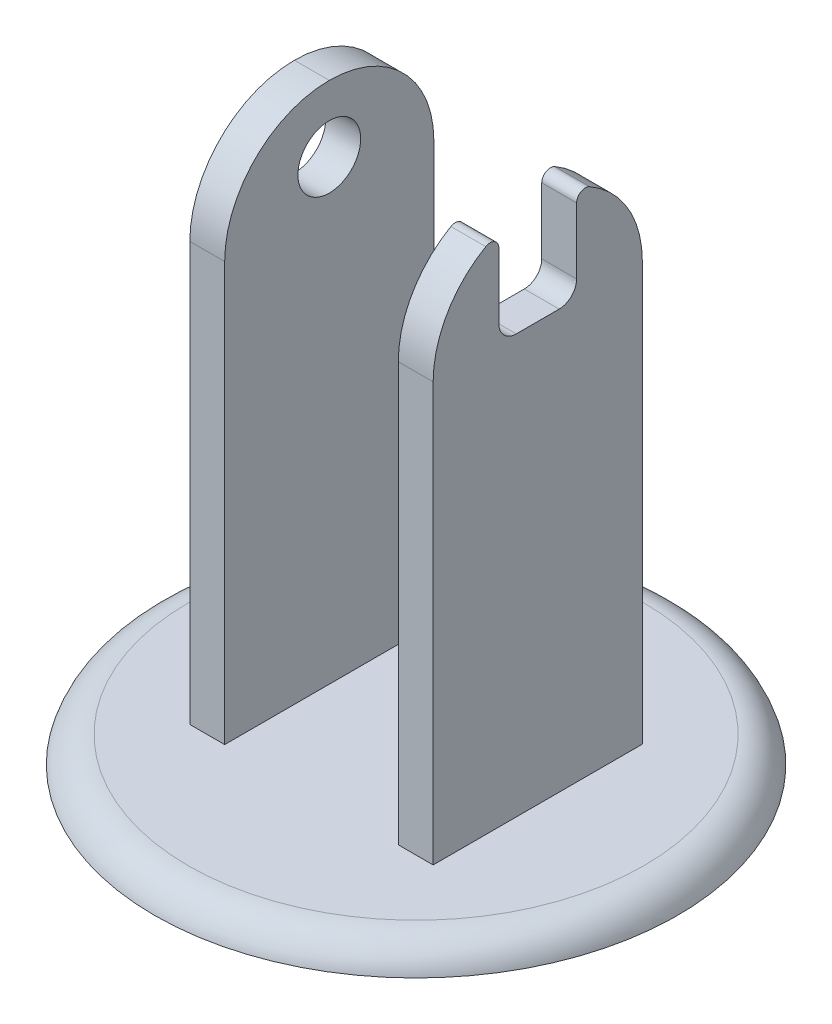
ISO-10303-21;
HEADER;
FILE_DESCRIPTION(('STEP AP214'),'2;1');
FILE_NAME('part.step','',(''),(''),'','','');
FILE_SCHEMA(('AUTOMOTIVE_DESIGN { 1 0 10303 214 1 1 1 1 }'));
ENDSEC;
DATA;
#1=APPLICATION_CONTEXT('core data for automotive mechanical design processes');
#2=APPLICATION_PROTOCOL_DEFINITION('international standard','automotive_design',2000,#1);
#3=PRODUCT_CONTEXT('',#1,'mechanical');
#4=PRODUCT('Part','Part','',(#3));
#5=PRODUCT_RELATED_PRODUCT_CATEGORY('part','',(#4));
#6=PRODUCT_DEFINITION_FORMATION('','',#4);
#7=PRODUCT_DEFINITION_CONTEXT('part definition',#1,'design');
#8=PRODUCT_DEFINITION('design','',#6,#7);
#9=PRODUCT_DEFINITION_SHAPE('','',#8);
#10=(LENGTH_UNIT() NAMED_UNIT(*) SI_UNIT(.MILLI.,.METRE.));
#11=(NAMED_UNIT(*) PLANE_ANGLE_UNIT() SI_UNIT($,.RADIAN.));
#12=(NAMED_UNIT(*) SI_UNIT($,.STERADIAN.) SOLID_ANGLE_UNIT());
#13=UNCERTAINTY_MEASURE_WITH_UNIT(LENGTH_MEASURE(1.E-05),#10,'distance_accuracy_value','');
#14=(GEOMETRIC_REPRESENTATION_CONTEXT(3) GLOBAL_UNCERTAINTY_ASSIGNED_CONTEXT((#13)) GLOBAL_UNIT_ASSIGNED_CONTEXT((#10,
#11,#12)) REPRESENTATION_CONTEXT('',''));
#15=CARTESIAN_POINT('',(0.,0.,0.));
#16=DIRECTION('',(0.,0.,1.));
#17=DIRECTION('',(1.,0.,0.));
#18=AXIS2_PLACEMENT_3D('',#15,#16,#17);
#19=CARTESIAN_POINT('',(0.,15.,0.));
#20=DIRECTION('',(0.,1.,0.));
#21=DIRECTION('',(0.,0.,1.));
#22=AXIS2_PLACEMENT_3D('',#19,#20,#21);
#23=PLANE('',#22);
#24=CARTESIAN_POINT('',(0.,15.,0.));
#25=DIRECTION('',(0.,1.,0.));
#26=DIRECTION('',(0.,0.,1.));
#27=AXIS2_PLACEMENT_3D('',#24,#25,#26);
#28=CIRCLE('',#27,65.3175416344815);
#29=CARTESIAN_POINT('',(0.,15.,65.3175416344815));
#30=VERTEX_POINT('',#29);
#31=EDGE_CURVE('E290',#30,#30,#28,.T.);
#32=ORIENTED_EDGE('',*,*,#31,.T.);
#33=EDGE_LOOP('',(#32));
#34=FACE_BOUND('',#33,.T.);
#35=DIRECTION('',(-1.,0.,0.));
#36=VECTOR('',#35,1.);
#37=CARTESIAN_POINT('',(-34.8963311687938,15.,-30.));
#38=LINE('',#37,#36);
#39=CARTESIAN_POINT('',(-24.8963311687938,15.,-30.));
#40=VERTEX_POINT('',#39);
#41=CARTESIAN_POINT('',(-34.8963311687938,15.,-30.));
#42=VERTEX_POINT('',#41);
#43=EDGE_CURVE('E237',#40,#42,#38,.T.);
#44=ORIENTED_EDGE('',*,*,#43,.F.);
#45=DIRECTION('',(0.,0.,-1.));
#46=VECTOR('',#45,1.);
#47=CARTESIAN_POINT('',(-24.8963311687938,15.,-30.));
#48=LINE('',#47,#46);
#49=CARTESIAN_POINT('',(-24.8963311687938,15.,30.));
#50=VERTEX_POINT('',#49);
#51=EDGE_CURVE('E234',#50,#40,#48,.T.);
#52=ORIENTED_EDGE('',*,*,#51,.F.);
#53=DIRECTION('',(1.,0.,0.));
#54=VECTOR('',#53,1.);
#55=CARTESIAN_POINT('',(-34.8963311687938,15.,30.));
#56=LINE('',#55,#54);
#57=CARTESIAN_POINT('',(-34.8963311687938,15.,30.));
#58=VERTEX_POINT('',#57);
#59=EDGE_CURVE('E243',#58,#50,#56,.T.);
#60=ORIENTED_EDGE('',*,*,#59,.F.);
#61=DIRECTION('',(0.,0.,1.));
#62=VECTOR('',#61,1.);
#63=CARTESIAN_POINT('',(-34.8963311687938,15.,-30.));
#64=LINE('',#63,#62);
#65=EDGE_CURVE('E240',#42,#58,#64,.T.);
#66=ORIENTED_EDGE('',*,*,#65,.F.);
#67=EDGE_LOOP('',(#44,#52,#60,#66));
#68=FACE_BOUND('',#67,.T.);
#69=DIRECTION('',(-1.,0.,0.));
#70=VECTOR('',#69,1.);
#71=CARTESIAN_POINT('',(34.8963311687938,15.,-30.0000000000001));
#72=LINE('',#71,#70);
#73=CARTESIAN_POINT('',(34.8963311687938,15.,-30.0000000000001));
#74=VERTEX_POINT('',#73);
#75=CARTESIAN_POINT('',(24.8963311687938,15.,-30.0000000000001));
#76=VERTEX_POINT('',#75);
#77=EDGE_CURVE('E228',#74,#76,#72,.T.);
#78=ORIENTED_EDGE('',*,*,#77,.F.);
#79=DIRECTION('',(0.,0.,-1.));
#80=VECTOR('',#79,1.);
#81=CARTESIAN_POINT('',(34.8963311687938,15.,-30.0000000000001));
#82=LINE('',#81,#80);
#83=CARTESIAN_POINT('',(34.8963311687938,15.,29.9999999999999));
#84=VERTEX_POINT('',#83);
#85=EDGE_CURVE('E231',#84,#74,#82,.T.);
#86=ORIENTED_EDGE('',*,*,#85,.F.);
#87=DIRECTION('',(1.,0.,0.));
#88=VECTOR('',#87,1.);
#89=CARTESIAN_POINT('',(34.8963311687938,15.,29.9999999999999));
#90=LINE('',#89,#88);
#91=CARTESIAN_POINT('',(24.8963311687938,15.,29.9999999999999));
#92=VERTEX_POINT('',#91);
#93=EDGE_CURVE('E222',#92,#84,#90,.T.);
#94=ORIENTED_EDGE('',*,*,#93,.F.);
#95=DIRECTION('',(0.,0.,1.));
#96=VECTOR('',#95,1.);
#97=CARTESIAN_POINT('',(24.8963311687938,15.,-30.0000000000001));
#98=LINE('',#97,#96);
#99=EDGE_CURVE('E225',#76,#92,#98,.T.);
#100=ORIENTED_EDGE('',*,*,#99,.F.);
#101=EDGE_LOOP('',(#78,#86,#94,#100));
#102=FACE_BOUND('',#101,.T.);
#103=ADVANCED_FACE('F43',(#34,#68,#102),#23,.T.);
#104=CARTESIAN_POINT('',(0.,7.5,0.));
#105=DIRECTION('',(0.,-1.,0.));
#106=DIRECTION('',(0.,0.,-1.));
#107=AXIS2_PLACEMENT_3D('',#104,#105,#106);
#108=CYLINDRICAL_SURFACE('',#107,50.);
#109=CARTESIAN_POINT('',(0.,7.5,0.));
#110=DIRECTION('',(0.,1.,0.));
#111=DIRECTION('',(0.,0.,1.));
#112=AXIS2_PLACEMENT_3D('',#109,#110,#111);
#113=CIRCLE('',#112,50.);
#114=CARTESIAN_POINT('',(0.,7.5,50.));
#115=VERTEX_POINT('',#114);
#116=EDGE_CURVE('E258',#115,#115,#113,.T.);
#117=ORIENTED_EDGE('',*,*,#116,.F.);
#118=EDGE_LOOP('',(#117));
#119=FACE_BOUND('',#118,.T.);
#120=CARTESIAN_POINT('',(0.,0.,0.));
#121=DIRECTION('',(0.,1.,0.));
#122=DIRECTION('',(0.,0.,1.));
#123=AXIS2_PLACEMENT_3D('',#120,#121,#122);
#124=CIRCLE('',#123,50.);
#125=CARTESIAN_POINT('',(0.,0.,50.));
#126=VERTEX_POINT('',#125);
#127=EDGE_CURVE('E257',#126,#126,#124,.T.);
#128=ORIENTED_EDGE('',*,*,#127,.T.);
#129=EDGE_LOOP('',(#128));
#130=FACE_BOUND('',#129,.T.);
#131=ADVANCED_FACE('F353',(#119,#130),#108,.T.);
#132=CARTESIAN_POINT('',(0.,0.,0.));
#133=DIRECTION('',(0.,1.,0.));
#134=DIRECTION('',(0.,0.,1.));
#135=AXIS2_PLACEMENT_3D('',#132,#133,#134);
#136=PLANE('',#135);
#137=ORIENTED_EDGE('',*,*,#127,.F.);
#138=EDGE_LOOP('',(#137));
#139=FACE_BOUND('',#138,.T.);
#140=ADVANCED_FACE('F359',(#139),#136,.F.);
#141=CARTESIAN_POINT('',(0.,7.5,0.));
#142=DIRECTION('',(0.,1.,0.));
#143=DIRECTION('',(0.,0.,1.));
#144=AXIS2_PLACEMENT_3D('',#141,#142,#143);
#145=PLANE('',#144);
#146=ORIENTED_EDGE('',*,*,#116,.T.);
#147=EDGE_LOOP('',(#146));
#148=FACE_BOUND('',#147,.T.);
#149=CARTESIAN_POINT('',(0.,7.5,0.));
#150=DIRECTION('',(0.,1.,0.));
#151=DIRECTION('',(0.,0.,1.));
#152=AXIS2_PLACEMENT_3D('',#149,#150,#151);
#153=CIRCLE('',#152,75.);
#154=CARTESIAN_POINT('',(0.,7.5,75.));
#155=VERTEX_POINT('',#154);
#156=EDGE_CURVE('E254',#155,#155,#153,.T.);
#157=ORIENTED_EDGE('',*,*,#156,.F.);
#158=EDGE_LOOP('',(#157));
#159=FACE_BOUND('',#158,.T.);
#160=ADVANCED_FACE('F367',(#148,#159),#145,.F.);
#161=CARTESIAN_POINT('',(-24.8963311687938,165.,-30.));
#162=DIRECTION('',(-1.,0.,0.));
#163=DIRECTION('',(0.,0.,1.));
#164=AXIS2_PLACEMENT_3D('',#161,#162,#163);
#165=PLANE('',#164);
#166=CARTESIAN_POINT('',(-24.8963311687938,146.,0.));
#167=DIRECTION('',(-1.,0.,0.));
#168=DIRECTION('',(0.,0.,1.));
#169=AXIS2_PLACEMENT_3D('',#166,#167,#168);
#170=CIRCLE('',#169,9.);
#171=CARTESIAN_POINT('',(-24.8963311687938,146.,9.));
#172=VERTEX_POINT('',#171);
#173=EDGE_CURVE('E198',#172,#172,#170,.T.);
#174=ORIENTED_EDGE('',*,*,#173,.T.);
#175=EDGE_LOOP('',(#174));
#176=FACE_BOUND('',#175,.T.);
#177=CARTESIAN_POINT('',(-24.8963311687938,135.,0.));
#178=DIRECTION('',(-1.,0.,0.));
#179=DIRECTION('',(0.,0.,1.));
#180=AXIS2_PLACEMENT_3D('',#177,#178,#179);
#181=CIRCLE('',#180,30.);
#182=CARTESIAN_POINT('',(-24.8963311687938,135.,-30.));
#183=VERTEX_POINT('',#182);
#184=CARTESIAN_POINT('',(-24.8963311687938,165.,0.));
#185=VERTEX_POINT('',#184);
#186=EDGE_CURVE('E275',#183,#185,#181,.F.);
#187=ORIENTED_EDGE('',*,*,#186,.T.);
#188=CARTESIAN_POINT('',(-24.8963311687938,135.,0.));
#189=DIRECTION('',(-1.,0.,0.));
#190=DIRECTION('',(0.,0.,1.));
#191=AXIS2_PLACEMENT_3D('',#188,#189,#190);
#192=CIRCLE('',#191,30.);
#193=CARTESIAN_POINT('',(-24.8963311687938,135.,30.));
#194=VERTEX_POINT('',#193);
#195=EDGE_CURVE('E277',#185,#194,#192,.F.);
#196=ORIENTED_EDGE('',*,*,#195,.T.);
#197=DIRECTION('',(0.,-1.,0.));
#198=VECTOR('',#197,1.);
#199=CARTESIAN_POINT('',(-24.8963311687938,165.,30.));
#200=LINE('',#199,#198);
#201=EDGE_CURVE('E246',#194,#50,#200,.T.);
#202=ORIENTED_EDGE('',*,*,#201,.T.);
#203=ORIENTED_EDGE('',*,*,#51,.T.);
#204=DIRECTION('',(0.,-1.,0.));
#205=VECTOR('',#204,1.);
#206=CARTESIAN_POINT('',(-24.8963311687938,165.,-30.));
#207=LINE('',#206,#205);
#208=EDGE_CURVE('E252',#183,#40,#207,.T.);
#209=ORIENTED_EDGE('',*,*,#208,.F.);
#210=EDGE_LOOP('',(#187,#196,#202,#203,#209));
#211=FACE_BOUND('',#210,.T.);
#212=ADVANCED_FACE('F365',(#176,#211),#165,.F.);
#213=CARTESIAN_POINT('',(-34.8963311687938,165.,-30.));
#214=DIRECTION('',(0.,0.,1.));
#215=DIRECTION('',(1.,0.,0.));
#216=AXIS2_PLACEMENT_3D('',#213,#214,#215);
#217=PLANE('',#216);
#218=DIRECTION('',(0.,-1.,0.));
#219=VECTOR('',#218,1.);
#220=CARTESIAN_POINT('',(-34.8963311687938,165.,-30.));
#221=LINE('',#220,#219);
#222=CARTESIAN_POINT('',(-34.8963311687938,135.,-30.));
#223=VERTEX_POINT('',#222);
#224=EDGE_CURVE('E250',#223,#42,#221,.T.);
#225=ORIENTED_EDGE('',*,*,#224,.F.);
#226=DIRECTION('',(-1.,0.,0.));
#227=VECTOR('',#226,1.);
#228=CARTESIAN_POINT('',(-24.8963311687938,135.,-30.));
#229=LINE('',#228,#227);
#230=EDGE_CURVE('E286',#223,#183,#229,.F.);
#231=ORIENTED_EDGE('',*,*,#230,.T.);
#232=ORIENTED_EDGE('',*,*,#208,.T.);
#233=ORIENTED_EDGE('',*,*,#43,.T.);
#234=EDGE_LOOP('',(#225,#231,#232,#233));
#235=FACE_BOUND('',#234,.T.);
#236=ADVANCED_FACE('F418',(#235),#217,.F.);
#237=CARTESIAN_POINT('',(-34.8963311687938,165.,-30.));
#238=DIRECTION('',(1.,0.,0.));
#239=DIRECTION('',(0.,0.,-1.));
#240=AXIS2_PLACEMENT_3D('',#237,#238,#239);
#241=PLANE('',#240);
#242=CARTESIAN_POINT('',(-34.8963311687938,146.,0.));
#243=DIRECTION('',(1.,0.,0.));
#244=DIRECTION('',(0.,0.,-1.));
#245=AXIS2_PLACEMENT_3D('',#242,#243,#244);
#246=CIRCLE('',#245,9.);
#247=CARTESIAN_POINT('',(-34.8963311687938,146.,-9.00000000000001));
#248=VERTEX_POINT('',#247);
#249=EDGE_CURVE('E47',#248,#248,#246,.T.);
#250=ORIENTED_EDGE('',*,*,#249,.T.);
#251=EDGE_LOOP('',(#250));
#252=FACE_BOUND('',#251,.T.);
#253=DIRECTION('',(0.,-1.,0.));
#254=VECTOR('',#253,1.);
#255=CARTESIAN_POINT('',(-34.8963311687938,165.,30.));
#256=LINE('',#255,#254);
#257=CARTESIAN_POINT('',(-34.8963311687938,135.,30.));
#258=VERTEX_POINT('',#257);
#259=EDGE_CURVE('E248',#258,#58,#256,.T.);
#260=ORIENTED_EDGE('',*,*,#259,.F.);
#261=CARTESIAN_POINT('',(-34.8963311687938,135.,0.));
#262=DIRECTION('',(1.,0.,0.));
#263=DIRECTION('',(0.,0.,-1.));
#264=AXIS2_PLACEMENT_3D('',#261,#262,#263);
#265=CIRCLE('',#264,30.);
#266=CARTESIAN_POINT('',(-34.8963311687938,165.,0.));
#267=VERTEX_POINT('',#266);
#268=EDGE_CURVE('E284',#258,#267,#265,.F.);
#269=ORIENTED_EDGE('',*,*,#268,.T.);
#270=CARTESIAN_POINT('',(-34.8963311687938,135.,0.));
#271=DIRECTION('',(1.,0.,0.));
#272=DIRECTION('',(0.,0.,-1.));
#273=AXIS2_PLACEMENT_3D('',#270,#271,#272);
#274=CIRCLE('',#273,30.);
#275=EDGE_CURVE('E282',#267,#223,#274,.F.);
#276=ORIENTED_EDGE('',*,*,#275,.T.);
#277=ORIENTED_EDGE('',*,*,#224,.T.);
#278=ORIENTED_EDGE('',*,*,#65,.T.);
#279=EDGE_LOOP('',(#260,#269,#276,#277,#278));
#280=FACE_BOUND('',#279,.T.);
#281=ADVANCED_FACE('F415',(#252,#280),#241,.F.);
#282=CARTESIAN_POINT('',(-34.8963311687938,165.,30.));
#283=DIRECTION('',(0.,0.,-1.));
#284=DIRECTION('',(-1.,0.,0.));
#285=AXIS2_PLACEMENT_3D('',#282,#283,#284);
#286=PLANE('',#285);
#287=ORIENTED_EDGE('',*,*,#201,.F.);
#288=DIRECTION('',(1.,0.,0.));
#289=VECTOR('',#288,1.);
#290=CARTESIAN_POINT('',(-34.8963311687938,135.,30.));
#291=LINE('',#290,#289);
#292=EDGE_CURVE('E279',#194,#258,#291,.F.);
#293=ORIENTED_EDGE('',*,*,#292,.T.);
#294=ORIENTED_EDGE('',*,*,#259,.T.);
#295=ORIENTED_EDGE('',*,*,#59,.T.);
#296=EDGE_LOOP('',(#287,#293,#294,#295));
#297=FACE_BOUND('',#296,.T.);
#298=ADVANCED_FACE('F406',(#297),#286,.F.);
#299=CARTESIAN_POINT('',(34.8963311687938,165.,-30.0000000000001));
#300=DIRECTION('',(-1.,0.,0.));
#301=DIRECTION('',(0.,0.,1.));
#302=AXIS2_PLACEMENT_3D('',#299,#300,#301);
#303=PLANE('',#302);
#304=CARTESIAN_POINT('',(34.8963311687938,135.,0.));
#305=DIRECTION('',(-1.,0.,0.));
#306=DIRECTION('',(0.,0.,1.));
#307=AXIS2_PLACEMENT_3D('',#304,#305,#306);
#308=CIRCLE('',#307,30.);
#309=CARTESIAN_POINT('',(34.8963311687938,135.,-30.0000000000001));
#310=VERTEX_POINT('',#309);
#311=CARTESIAN_POINT('',(34.8963311687938,161.043441140646,-14.8909090909091));
#312=VERTEX_POINT('',#311);
#313=EDGE_CURVE('E261',#310,#312,#308,.F.);
#314=ORIENTED_EDGE('',*,*,#313,.T.);
#315=CARTESIAN_POINT('',(34.8963311687938,158.873154378925,-13.6500000000001));
#316=DIRECTION('',(-1.,0.,0.));
#317=DIRECTION('',(0.,0.,1.));
#318=AXIS2_PLACEMENT_3D('',#315,#316,#317);
#319=CIRCLE('',#318,2.5);
#320=CARTESIAN_POINT('',(34.8963311687938,158.873154378925,-11.15));
#321=VERTEX_POINT('',#320);
#322=EDGE_CURVE('E304',#312,#321,#319,.F.);
#323=ORIENTED_EDGE('',*,*,#322,.T.);
#324=DIRECTION('',(0.,1.,0.));
#325=VECTOR('',#324,1.);
#326=CARTESIAN_POINT('',(34.8963311687938,195.,-11.15));
#327=LINE('',#326,#325);
#328=CARTESIAN_POINT('',(34.8963311687938,140.,-11.15));
#329=VERTEX_POINT('',#328);
#330=EDGE_CURVE('E173',#329,#321,#327,.T.);
#331=ORIENTED_EDGE('',*,*,#330,.F.);
#332=CARTESIAN_POINT('',(34.8963311687938,140.,-6.15000000000005));
#333=DIRECTION('',(1.,0.,0.));
#334=DIRECTION('',(0.,0.,-1.));
#335=AXIS2_PLACEMENT_3D('',#332,#333,#334);
#336=CIRCLE('',#335,5.);
#337=CARTESIAN_POINT('',(34.8963311687938,135.,-6.15000000000001));
#338=VERTEX_POINT('',#337);
#339=EDGE_CURVE('E203',#338,#329,#336,.T.);
#340=ORIENTED_EDGE('',*,*,#339,.F.);
#341=DIRECTION('',(0.,0.,-1.));
#342=VECTOR('',#341,1.);
#343=CARTESIAN_POINT('',(34.8963311687938,135.,6.14999999999992));
#344=LINE('',#343,#342);
#345=CARTESIAN_POINT('',(34.8963311687938,135.,6.14999999999992));
#346=VERTEX_POINT('',#345);
#347=EDGE_CURVE('E200',#346,#338,#344,.T.);
#348=ORIENTED_EDGE('',*,*,#347,.F.);
#349=CARTESIAN_POINT('',(34.8963311687938,140.,6.14999999999995));
#350=DIRECTION('',(1.,0.,0.));
#351=DIRECTION('',(0.,0.,1.));
#352=AXIS2_PLACEMENT_3D('',#349,#350,#351);
#353=CIRCLE('',#352,5.);
#354=CARTESIAN_POINT('',(34.8963311687938,140.,11.15));
#355=VERTEX_POINT('',#354);
#356=EDGE_CURVE('E197',#355,#346,#353,.T.);
#357=ORIENTED_EDGE('',*,*,#356,.F.);
#358=DIRECTION('',(0.,-1.,0.));
#359=VECTOR('',#358,1.);
#360=CARTESIAN_POINT('',(34.8963311687938,195.,11.15));
#361=LINE('',#360,#359);
#362=CARTESIAN_POINT('',(34.8963311687938,158.873154378925,11.15));
#363=VERTEX_POINT('',#362);
#364=EDGE_CURVE('E178',#363,#355,#361,.T.);
#365=ORIENTED_EDGE('',*,*,#364,.F.);
#366=CARTESIAN_POINT('',(34.8963311687938,158.873154378925,13.6499999999999));
#367=DIRECTION('',(-1.,0.,0.));
#368=DIRECTION('',(0.,0.,1.));
#369=AXIS2_PLACEMENT_3D('',#366,#367,#368);
#370=CIRCLE('',#369,2.5);
#371=CARTESIAN_POINT('',(34.8963311687938,161.043441140646,14.890909090909));
#372=VERTEX_POINT('',#371);
#373=EDGE_CURVE('E59',#363,#372,#370,.F.);
#374=ORIENTED_EDGE('',*,*,#373,.T.);
#375=CARTESIAN_POINT('',(34.8963311687938,135.,0.));
#376=DIRECTION('',(-1.,0.,0.));
#377=DIRECTION('',(0.,0.,1.));
#378=AXIS2_PLACEMENT_3D('',#375,#376,#377);
#379=CIRCLE('',#378,30.);
#380=CARTESIAN_POINT('',(34.8963311687938,135.,29.9999999999999));
#381=VERTEX_POINT('',#380);
#382=EDGE_CURVE('E266',#372,#381,#379,.F.);
#383=ORIENTED_EDGE('',*,*,#382,.T.);
#384=DIRECTION('',(0.,-1.,0.));
#385=VECTOR('',#384,1.);
#386=CARTESIAN_POINT('',(34.8963311687938,165.,29.9999999999999));
#387=LINE('',#386,#385);
#388=EDGE_CURVE('E220',#381,#84,#387,.T.);
#389=ORIENTED_EDGE('',*,*,#388,.T.);
#390=ORIENTED_EDGE('',*,*,#85,.T.);
#391=DIRECTION('',(0.,-1.,0.));
#392=VECTOR('',#391,1.);
#393=CARTESIAN_POINT('',(34.8963311687938,165.,-30.0000000000001));
#394=LINE('',#393,#392);
#395=EDGE_CURVE('E214',#310,#74,#394,.T.);
#396=ORIENTED_EDGE('',*,*,#395,.F.);
#397=EDGE_LOOP('',(#314,#323,#331,#340,#348,#357,#365,#374,#383,#389,#390,#396));
#398=FACE_BOUND('',#397,.T.);
#399=ADVANCED_FACE('F306',(#398),#303,.F.);
#400=CARTESIAN_POINT('',(34.8963311687938,165.,-30.0000000000001));
#401=DIRECTION('',(0.,0.,1.));
#402=DIRECTION('',(1.,0.,0.));
#403=AXIS2_PLACEMENT_3D('',#400,#401,#402);
#404=PLANE('',#403);
#405=DIRECTION('',(0.,-1.,0.));
#406=VECTOR('',#405,1.);
#407=CARTESIAN_POINT('',(24.8963311687938,165.,-30.0000000000001));
#408=LINE('',#407,#406);
#409=CARTESIAN_POINT('',(24.8963311687938,135.,-30.0000000000001));
#410=VERTEX_POINT('',#409);
#411=EDGE_CURVE('E216',#410,#76,#408,.T.);
#412=ORIENTED_EDGE('',*,*,#411,.F.);
#413=DIRECTION('',(-1.,0.,0.));
#414=VECTOR('',#413,1.);
#415=CARTESIAN_POINT('',(34.8963311687938,135.,-30.0000000000001));
#416=LINE('',#415,#414);
#417=EDGE_CURVE('E288',#410,#310,#416,.F.);
#418=ORIENTED_EDGE('',*,*,#417,.T.);
#419=ORIENTED_EDGE('',*,*,#395,.T.);
#420=ORIENTED_EDGE('',*,*,#77,.T.);
#421=EDGE_LOOP('',(#412,#418,#419,#420));
#422=FACE_BOUND('',#421,.T.);
#423=ADVANCED_FACE('F331',(#422),#404,.F.);
#424=CARTESIAN_POINT('',(24.8963311687938,165.,-30.0000000000001));
#425=DIRECTION('',(1.,0.,0.));
#426=DIRECTION('',(0.,0.,-1.));
#427=AXIS2_PLACEMENT_3D('',#424,#425,#426);
#428=PLANE('',#427);
#429=DIRECTION('',(0.,1.,0.));
#430=VECTOR('',#429,1.);
#431=CARTESIAN_POINT('',(24.8963311687938,195.,-11.15));
#432=LINE('',#431,#430);
#433=CARTESIAN_POINT('',(24.8963311687938,140.,-11.15));
#434=VERTEX_POINT('',#433);
#435=CARTESIAN_POINT('',(24.8963311687938,158.873154378925,-11.15));
#436=VERTEX_POINT('',#435);
#437=EDGE_CURVE('E183',#434,#436,#432,.T.);
#438=ORIENTED_EDGE('',*,*,#437,.T.);
#439=CARTESIAN_POINT('',(24.8963311687938,158.873154378925,-13.6500000000001));
#440=DIRECTION('',(1.,0.,0.));
#441=DIRECTION('',(0.,0.,-1.));
#442=AXIS2_PLACEMENT_3D('',#439,#440,#441);
#443=CIRCLE('',#442,2.5);
#444=CARTESIAN_POINT('',(24.8963311687938,161.043441140646,-14.8909090909091));
#445=VERTEX_POINT('',#444);
#446=EDGE_CURVE('E299',#436,#445,#443,.F.);
#447=ORIENTED_EDGE('',*,*,#446,.T.);
#448=CARTESIAN_POINT('',(24.8963311687938,135.,0.));
#449=DIRECTION('',(1.,0.,0.));
#450=DIRECTION('',(0.,0.,-1.));
#451=AXIS2_PLACEMENT_3D('',#448,#449,#450);
#452=CIRCLE('',#451,30.);
#453=EDGE_CURVE('E271',#445,#410,#452,.F.);
#454=ORIENTED_EDGE('',*,*,#453,.T.);
#455=ORIENTED_EDGE('',*,*,#411,.T.);
#456=ORIENTED_EDGE('',*,*,#99,.T.);
#457=DIRECTION('',(0.,-1.,0.));
#458=VECTOR('',#457,1.);
#459=CARTESIAN_POINT('',(24.8963311687938,165.,29.9999999999999));
#460=LINE('',#459,#458);
#461=CARTESIAN_POINT('',(24.8963311687938,135.,29.9999999999999));
#462=VERTEX_POINT('',#461);
#463=EDGE_CURVE('E218',#462,#92,#460,.T.);
#464=ORIENTED_EDGE('',*,*,#463,.F.);
#465=CARTESIAN_POINT('',(24.8963311687938,135.,0.));
#466=DIRECTION('',(1.,0.,0.));
#467=DIRECTION('',(0.,0.,-1.));
#468=AXIS2_PLACEMENT_3D('',#465,#466,#467);
#469=CIRCLE('',#468,30.);
#470=CARTESIAN_POINT('',(24.8963311687938,161.043441140646,14.890909090909));
#471=VERTEX_POINT('',#470);
#472=EDGE_CURVE('E273',#462,#471,#469,.F.);
#473=ORIENTED_EDGE('',*,*,#472,.T.);
#474=CARTESIAN_POINT('',(24.8963311687938,158.873154378925,13.6499999999999));
#475=DIRECTION('',(1.,0.,0.));
#476=DIRECTION('',(0.,0.,-1.));
#477=AXIS2_PLACEMENT_3D('',#474,#475,#476);
#478=CIRCLE('',#477,2.5);
#479=CARTESIAN_POINT('',(24.8963311687938,158.873154378925,11.15));
#480=VERTEX_POINT('',#479);
#481=EDGE_CURVE('E171',#471,#480,#478,.F.);
#482=ORIENTED_EDGE('',*,*,#481,.T.);
#483=DIRECTION('',(0.,-1.,0.));
#484=VECTOR('',#483,1.);
#485=CARTESIAN_POINT('',(24.8963311687938,195.,11.15));
#486=LINE('',#485,#484);
#487=CARTESIAN_POINT('',(24.8963311687938,140.,11.15));
#488=VERTEX_POINT('',#487);
#489=EDGE_CURVE('E162',#480,#488,#486,.T.);
#490=ORIENTED_EDGE('',*,*,#489,.T.);
#491=CARTESIAN_POINT('',(24.8963311687938,140.,6.14999999999995));
#492=DIRECTION('',(1.,0.,0.));
#493=DIRECTION('',(0.,0.,1.));
#494=AXIS2_PLACEMENT_3D('',#491,#492,#493);
#495=CIRCLE('',#494,5.);
#496=CARTESIAN_POINT('',(24.8963311687938,135.,6.14999999999992));
#497=VERTEX_POINT('',#496);
#498=EDGE_CURVE('E168',#488,#497,#495,.T.);
#499=ORIENTED_EDGE('',*,*,#498,.T.);
#500=DIRECTION('',(0.,0.,-1.));
#501=VECTOR('',#500,1.);
#502=CARTESIAN_POINT('',(24.8963311687938,135.,6.14999999999992));
#503=LINE('',#502,#501);
#504=CARTESIAN_POINT('',(24.8963311687938,135.,-6.15000000000001));
#505=VERTEX_POINT('',#504);
#506=EDGE_CURVE('E187',#497,#505,#503,.T.);
#507=ORIENTED_EDGE('',*,*,#506,.T.);
#508=CARTESIAN_POINT('',(24.8963311687938,140.,-6.15000000000005));
#509=DIRECTION('',(1.,0.,0.));
#510=DIRECTION('',(0.,0.,-1.));
#511=AXIS2_PLACEMENT_3D('',#508,#509,#510);
#512=CIRCLE('',#511,5.);
#513=EDGE_CURVE('E189',#505,#434,#512,.T.);
#514=ORIENTED_EDGE('',*,*,#513,.T.);
#515=EDGE_LOOP('',(#438,#447,#454,#455,#456,#464,#473,#482,#490,#499,#507,#514));
#516=FACE_BOUND('',#515,.T.);
#517=ADVANCED_FACE('F165',(#516),#428,.F.);
#518=CARTESIAN_POINT('',(34.8963311687938,165.,29.9999999999999));
#519=DIRECTION('',(0.,0.,-1.));
#520=DIRECTION('',(-1.,0.,0.));
#521=AXIS2_PLACEMENT_3D('',#518,#519,#520);
#522=PLANE('',#521);
#523=ORIENTED_EDGE('',*,*,#388,.F.);
#524=DIRECTION('',(1.,0.,0.));
#525=VECTOR('',#524,1.);
#526=CARTESIAN_POINT('',(34.8963311687938,135.,29.9999999999999));
#527=LINE('',#526,#525);
#528=EDGE_CURVE('E268',#381,#462,#527,.F.);
#529=ORIENTED_EDGE('',*,*,#528,.T.);
#530=ORIENTED_EDGE('',*,*,#463,.T.);
#531=ORIENTED_EDGE('',*,*,#93,.T.);
#532=EDGE_LOOP('',(#523,#529,#530,#531));
#533=FACE_BOUND('',#532,.T.);
#534=ADVANCED_FACE('F340',(#533),#522,.F.);
#535=CARTESIAN_POINT('',(0.,135.,0.));
#536=DIRECTION('',(-1.,0.,0.));
#537=DIRECTION('',(0.,0.,1.));
#538=AXIS2_PLACEMENT_3D('',#535,#536,#537);
#539=CYLINDRICAL_SURFACE('',#538,30.);
#540=ORIENTED_EDGE('',*,*,#453,.F.);
#541=DIRECTION('',(-1.,0.,0.));
#542=VECTOR('',#541,1.);
#543=CARTESIAN_POINT('',(0.,161.043441140646,-14.8909090909091));
#544=LINE('',#543,#542);
#545=EDGE_CURVE('E301',#445,#312,#544,.F.);
#546=ORIENTED_EDGE('',*,*,#545,.T.);
#547=ORIENTED_EDGE('',*,*,#313,.F.);
#548=ORIENTED_EDGE('',*,*,#417,.F.);
#549=EDGE_LOOP('',(#540,#546,#547,#548));
#550=FACE_BOUND('',#549,.T.);
#551=ADVANCED_FACE('F327',(#550),#539,.T.);
#552=CARTESIAN_POINT('',(0.,135.,0.));
#553=DIRECTION('',(1.,0.,0.));
#554=DIRECTION('',(0.,0.,-1.));
#555=AXIS2_PLACEMENT_3D('',#552,#553,#554);
#556=CYLINDRICAL_SURFACE('',#555,30.);
#557=ORIENTED_EDGE('',*,*,#382,.F.);
#558=DIRECTION('',(1.,0.,0.));
#559=VECTOR('',#558,1.);
#560=CARTESIAN_POINT('',(0.,161.043441140646,14.890909090909));
#561=LINE('',#560,#559);
#562=EDGE_CURVE('E11',#372,#471,#561,.F.);
#563=ORIENTED_EDGE('',*,*,#562,.T.);
#564=ORIENTED_EDGE('',*,*,#472,.F.);
#565=ORIENTED_EDGE('',*,*,#528,.F.);
#566=EDGE_LOOP('',(#557,#563,#564,#565));
#567=FACE_BOUND('',#566,.T.);
#568=ADVANCED_FACE('F343',(#567),#556,.T.);
#569=CARTESIAN_POINT('',(0.,135.,0.));
#570=DIRECTION('',(1.,0.,0.));
#571=DIRECTION('',(0.,0.,-1.));
#572=AXIS2_PLACEMENT_3D('',#569,#570,#571);
#573=CYLINDRICAL_SURFACE('',#572,30.);
#574=ORIENTED_EDGE('',*,*,#230,.F.);
#575=ORIENTED_EDGE('',*,*,#275,.F.);
#576=DIRECTION('',(-1.,0.,0.));
#577=VECTOR('',#576,1.);
#578=CARTESIAN_POINT('',(-34.8963311687938,165.,0.));
#579=LINE('',#578,#577);
#580=EDGE_CURVE('E210',#185,#267,#579,.T.);
#581=ORIENTED_EDGE('',*,*,#580,.F.);
#582=ORIENTED_EDGE('',*,*,#186,.F.);
#583=EDGE_LOOP('',(#574,#575,#581,#582));
#584=FACE_BOUND('',#583,.T.);
#585=ADVANCED_FACE('F376',(#584),#573,.T.);
#586=CARTESIAN_POINT('',(0.,135.,0.));
#587=DIRECTION('',(-1.,0.,0.));
#588=DIRECTION('',(0.,0.,1.));
#589=AXIS2_PLACEMENT_3D('',#586,#587,#588);
#590=CYLINDRICAL_SURFACE('',#589,30.);
#591=ORIENTED_EDGE('',*,*,#268,.F.);
#592=ORIENTED_EDGE('',*,*,#292,.F.);
#593=ORIENTED_EDGE('',*,*,#195,.F.);
#594=ORIENTED_EDGE('',*,*,#580,.T.);
#595=EDGE_LOOP('',(#591,#592,#593,#594));
#596=FACE_BOUND('',#595,.T.);
#597=ADVANCED_FACE('F379',(#596),#590,.T.);
#598=CARTESIAN_POINT('',(0.,5.,0.));
#599=DIRECTION('',(0.,-1.,0.));
#600=DIRECTION('',(0.,0.,-1.));
#601=AXIS2_PLACEMENT_3D('',#598,#599,#600);
#602=TOROIDAL_SURFACE('',#601,65.3175416344815,10.);
#603=ORIENTED_EDGE('',*,*,#156,.T.);
#604=EDGE_LOOP('',(#603));
#605=FACE_BOUND('',#604,.T.);
#606=ORIENTED_EDGE('',*,*,#31,.F.);
#607=EDGE_LOOP('',(#606));
#608=FACE_BOUND('',#607,.T.);
#609=ADVANCED_FACE('F382',(#605,#608),#602,.T.);
#610=CARTESIAN_POINT('',(24.8963311687938,195.,11.15));
#611=DIRECTION('',(0.,0.,1.));
#612=DIRECTION('',(1.,0.,0.));
#613=AXIS2_PLACEMENT_3D('',#610,#611,#612);
#614=PLANE('',#613);
#615=ORIENTED_EDGE('',*,*,#489,.F.);
#616=DIRECTION('',(-1.,0.,0.));
#617=VECTOR('',#616,1.);
#618=CARTESIAN_POINT('',(34.8963311687938,158.873154378925,11.15));
#619=LINE('',#618,#617);
#620=EDGE_CURVE('E52',#480,#363,#619,.F.);
#621=ORIENTED_EDGE('',*,*,#620,.T.);
#622=ORIENTED_EDGE('',*,*,#364,.T.);
#623=DIRECTION('',(1.,0.,0.));
#624=VECTOR('',#623,1.);
#625=CARTESIAN_POINT('',(24.8963311687938,140.,11.15));
#626=LINE('',#625,#624);
#627=EDGE_CURVE('E176',#488,#355,#626,.T.);
#628=ORIENTED_EDGE('',*,*,#627,.F.);
#629=EDGE_LOOP('',(#615,#621,#622,#628));
#630=FACE_BOUND('',#629,.T.);
#631=ADVANCED_FACE('F177',(#630),#614,.F.);
#632=CARTESIAN_POINT('',(24.8963311687938,195.,-11.15));
#633=DIRECTION('',(0.,0.,-1.));
#634=DIRECTION('',(-1.,0.,0.));
#635=AXIS2_PLACEMENT_3D('',#632,#633,#634);
#636=PLANE('',#635);
#637=ORIENTED_EDGE('',*,*,#330,.T.);
#638=DIRECTION('',(1.,0.,0.));
#639=VECTOR('',#638,1.);
#640=CARTESIAN_POINT('',(24.8963311687938,158.873154378925,-11.15));
#641=LINE('',#640,#639);
#642=EDGE_CURVE('E295',#321,#436,#641,.F.);
#643=ORIENTED_EDGE('',*,*,#642,.T.);
#644=ORIENTED_EDGE('',*,*,#437,.F.);
#645=DIRECTION('',(1.,0.,0.));
#646=VECTOR('',#645,1.);
#647=CARTESIAN_POINT('',(24.8963311687938,140.,-11.15));
#648=LINE('',#647,#646);
#649=EDGE_CURVE('E208',#434,#329,#648,.T.);
#650=ORIENTED_EDGE('',*,*,#649,.T.);
#651=EDGE_LOOP('',(#637,#643,#644,#650));
#652=FACE_BOUND('',#651,.T.);
#653=ADVANCED_FACE('F317',(#652),#636,.F.);
#654=CARTESIAN_POINT('',(24.8963311687938,140.,-6.15000000000005));
#655=DIRECTION('',(1.,0.,0.));
#656=DIRECTION('',(0.,0.,-1.));
#657=AXIS2_PLACEMENT_3D('',#654,#655,#656);
#658=CYLINDRICAL_SURFACE('',#657,5.);
#659=ORIENTED_EDGE('',*,*,#339,.T.);
#660=ORIENTED_EDGE('',*,*,#649,.F.);
#661=ORIENTED_EDGE('',*,*,#513,.F.);
#662=DIRECTION('',(1.,0.,0.));
#663=VECTOR('',#662,1.);
#664=CARTESIAN_POINT('',(24.8963311687938,135.,-6.15000000000001));
#665=LINE('',#664,#663);
#666=EDGE_CURVE('E211',#505,#338,#665,.T.);
#667=ORIENTED_EDGE('',*,*,#666,.T.);
#668=EDGE_LOOP('',(#659,#660,#661,#667));
#669=FACE_BOUND('',#668,.T.);
#670=ADVANCED_FACE('F315',(#669),#658,.F.);
#671=CARTESIAN_POINT('',(24.8963311687938,135.,6.14999999999992));
#672=DIRECTION('',(0.,-1.,0.));
#673=DIRECTION('',(0.,0.,-1.));
#674=AXIS2_PLACEMENT_3D('',#671,#672,#673);
#675=PLANE('',#674);
#676=ORIENTED_EDGE('',*,*,#347,.T.);
#677=ORIENTED_EDGE('',*,*,#666,.F.);
#678=ORIENTED_EDGE('',*,*,#506,.F.);
#679=DIRECTION('',(1.,0.,0.));
#680=VECTOR('',#679,1.);
#681=CARTESIAN_POINT('',(24.8963311687938,135.,6.14999999999992));
#682=LINE('',#681,#680);
#683=EDGE_CURVE('E182',#497,#346,#682,.T.);
#684=ORIENTED_EDGE('',*,*,#683,.T.);
#685=EDGE_LOOP('',(#676,#677,#678,#684));
#686=FACE_BOUND('',#685,.T.);
#687=ADVANCED_FACE('F311',(#686),#675,.F.);
#688=CARTESIAN_POINT('',(24.8963311687938,140.,6.14999999999995));
#689=DIRECTION('',(1.,0.,0.));
#690=DIRECTION('',(0.,0.,-1.));
#691=AXIS2_PLACEMENT_3D('',#688,#689,#690);
#692=CYLINDRICAL_SURFACE('',#691,5.);
#693=ORIENTED_EDGE('',*,*,#356,.T.);
#694=ORIENTED_EDGE('',*,*,#683,.F.);
#695=ORIENTED_EDGE('',*,*,#498,.F.);
#696=ORIENTED_EDGE('',*,*,#627,.T.);
#697=EDGE_LOOP('',(#693,#694,#695,#696));
#698=FACE_BOUND('',#697,.T.);
#699=ADVANCED_FACE('F185',(#698),#692,.F.);
#700=CARTESIAN_POINT('',(0.,158.873154378925,-13.6500000000001));
#701=DIRECTION('',(-1.,0.,0.));
#702=DIRECTION('',(0.,0.,1.));
#703=AXIS2_PLACEMENT_3D('',#700,#701,#702);
#704=CYLINDRICAL_SURFACE('',#703,2.5);
#705=ORIENTED_EDGE('',*,*,#322,.F.);
#706=ORIENTED_EDGE('',*,*,#545,.F.);
#707=ORIENTED_EDGE('',*,*,#446,.F.);
#708=ORIENTED_EDGE('',*,*,#642,.F.);
#709=EDGE_LOOP('',(#705,#706,#707,#708));
#710=FACE_BOUND('',#709,.T.);
#711=ADVANCED_FACE('F321',(#710),#704,.T.);
#712=CARTESIAN_POINT('',(0.,158.873154378925,13.6499999999999));
#713=DIRECTION('',(1.,0.,0.));
#714=DIRECTION('',(0.,0.,-1.));
#715=AXIS2_PLACEMENT_3D('',#712,#713,#714);
#716=CYLINDRICAL_SURFACE('',#715,2.5);
#717=ORIENTED_EDGE('',*,*,#481,.F.);
#718=ORIENTED_EDGE('',*,*,#562,.F.);
#719=ORIENTED_EDGE('',*,*,#373,.F.);
#720=ORIENTED_EDGE('',*,*,#620,.F.);
#721=EDGE_LOOP('',(#717,#718,#719,#720));
#722=FACE_BOUND('',#721,.T.);
#723=ADVANCED_FACE('F45',(#722),#716,.T.);
#724=CARTESIAN_POINT('',(-75.,146.,0.));
#725=DIRECTION('',(1.,0.,0.));
#726=DIRECTION('',(0.,0.,-1.));
#727=AXIS2_PLACEMENT_3D('',#724,#725,#726);
#728=CYLINDRICAL_SURFACE('',#727,9.);
#729=ORIENTED_EDGE('',*,*,#249,.F.);
#730=EDGE_LOOP('',(#729));
#731=FACE_BOUND('',#730,.T.);
#732=ORIENTED_EDGE('',*,*,#173,.F.);
#733=EDGE_LOOP('',(#732));
#734=FACE_BOUND('',#733,.T.);
#735=ADVANCED_FACE('F345',(#731,#734),#728,.F.);
#736=CLOSED_SHELL('',(#103,#131,#140,#160,#212,#236,#281,#298,#399,#423,#517,#534,#551,#568,
#585,#597,#609,#631,#653,#670,#687,#699,#711,#723,#735));
#737=MANIFOLD_SOLID_BREP('B2',#736);
#738=ADVANCED_BREP_SHAPE_REPRESENTATION('',(#18,#737),#14);
#739=SHAPE_DEFINITION_REPRESENTATION(#9,#738);
ENDSEC;
END-ISO-10303-21;
